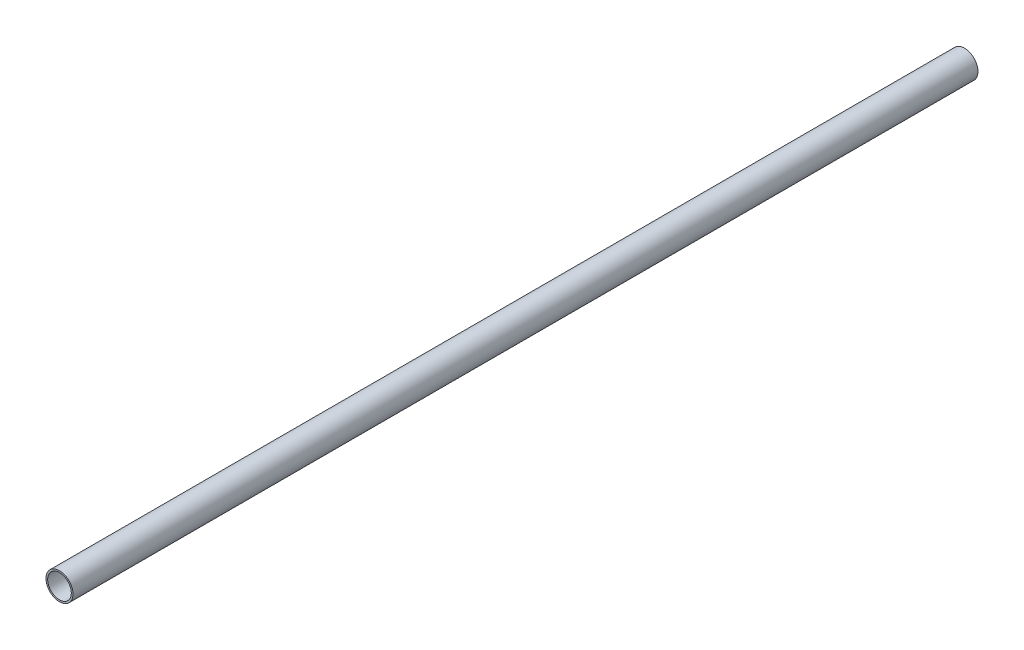
ISO-10303-21;
HEADER;
FILE_DESCRIPTION(('STEP AP214'),'2;1');
FILE_NAME('part.step','',(''),(''),'','','');
FILE_SCHEMA(('AUTOMOTIVE_DESIGN { 1 0 10303 214 1 1 1 1 }'));
ENDSEC;
DATA;
#1=APPLICATION_CONTEXT('core data for automotive mechanical design processes');
#2=APPLICATION_PROTOCOL_DEFINITION('international standard','automotive_design',2000,#1);
#3=PRODUCT_CONTEXT('',#1,'mechanical');
#4=PRODUCT('Part','Part','',(#3));
#5=PRODUCT_RELATED_PRODUCT_CATEGORY('part','',(#4));
#6=PRODUCT_DEFINITION_FORMATION('','',#4);
#7=PRODUCT_DEFINITION_CONTEXT('part definition',#1,'design');
#8=PRODUCT_DEFINITION('design','',#6,#7);
#9=PRODUCT_DEFINITION_SHAPE('','',#8);
#10=(LENGTH_UNIT() NAMED_UNIT(*) SI_UNIT(.MILLI.,.METRE.));
#11=(NAMED_UNIT(*) PLANE_ANGLE_UNIT() SI_UNIT($,.RADIAN.));
#12=(NAMED_UNIT(*) SI_UNIT($,.STERADIAN.) SOLID_ANGLE_UNIT());
#13=UNCERTAINTY_MEASURE_WITH_UNIT(LENGTH_MEASURE(1.E-05),#10,'distance_accuracy_value','');
#14=(GEOMETRIC_REPRESENTATION_CONTEXT(3) GLOBAL_UNCERTAINTY_ASSIGNED_CONTEXT((#13)) GLOBAL_UNIT_ASSIGNED_CONTEXT((#10,
#11,#12)) REPRESENTATION_CONTEXT('',''));
#15=CARTESIAN_POINT('',(0.,0.,0.));
#16=DIRECTION('',(0.,0.,1.));
#17=DIRECTION('',(1.,0.,0.));
#18=AXIS2_PLACEMENT_3D('',#15,#16,#17);
#19=CARTESIAN_POINT('',(0.,0.,914.4));
#20=DIRECTION('',(0.,0.,-1.));
#21=DIRECTION('',(-1.,0.,0.));
#22=AXIS2_PLACEMENT_3D('',#19,#20,#21);
#23=CYLINDRICAL_SURFACE('',#22,12.7);
#24=CARTESIAN_POINT('',(0.,0.,0.));
#25=DIRECTION('',(0.,0.,1.));
#26=DIRECTION('',(1.,0.,0.));
#27=AXIS2_PLACEMENT_3D('',#24,#25,#26);
#28=CIRCLE('',#27,12.7);
#29=CARTESIAN_POINT('',(12.7,0.,0.));
#30=VERTEX_POINT('',#29);
#31=EDGE_CURVE('E10',#30,#30,#28,.T.);
#32=ORIENTED_EDGE('',*,*,#31,.T.);
#33=EDGE_LOOP('',(#32));
#34=FACE_BOUND('',#33,.T.);
#35=CARTESIAN_POINT('',(0.,0.,850.9));
#36=DIRECTION('',(0.,0.,1.));
#37=DIRECTION('',(1.,0.,0.));
#38=AXIS2_PLACEMENT_3D('',#35,#36,#37);
#39=CIRCLE('',#38,12.7);
#40=CARTESIAN_POINT('',(12.7,0.,850.9));
#41=VERTEX_POINT('',#40);
#42=EDGE_CURVE('E41',#41,#41,#39,.T.);
#43=ORIENTED_EDGE('',*,*,#42,.F.);
#44=EDGE_LOOP('',(#43));
#45=FACE_BOUND('',#44,.T.);
#46=ADVANCED_FACE('F30',(#34,#45),#23,.T.);
#47=CARTESIAN_POINT('',(0.,0.,914.4));
#48=DIRECTION('',(0.,0.,-1.));
#49=DIRECTION('',(-1.,0.,0.));
#50=AXIS2_PLACEMENT_3D('',#47,#48,#49);
#51=CYLINDRICAL_SURFACE('',#50,11.1125);
#52=CARTESIAN_POINT('',(0.,0.,0.));
#53=DIRECTION('',(0.,0.,1.));
#54=DIRECTION('',(1.,0.,0.));
#55=AXIS2_PLACEMENT_3D('',#52,#53,#54);
#56=CIRCLE('',#55,11.1125);
#57=CARTESIAN_POINT('',(11.1125,0.,0.));
#58=VERTEX_POINT('',#57);
#59=EDGE_CURVE('E37',#58,#58,#56,.T.);
#60=ORIENTED_EDGE('',*,*,#59,.F.);
#61=EDGE_LOOP('',(#60));
#62=FACE_BOUND('',#61,.T.);
#63=CARTESIAN_POINT('',(0.,0.,850.9));
#64=DIRECTION('',(0.,0.,1.));
#65=DIRECTION('',(1.,0.,0.));
#66=AXIS2_PLACEMENT_3D('',#63,#64,#65);
#67=CIRCLE('',#66,11.1125);
#68=CARTESIAN_POINT('',(11.1125,0.,850.9));
#69=VERTEX_POINT('',#68);
#70=EDGE_CURVE('E33',#69,#69,#67,.T.);
#71=ORIENTED_EDGE('',*,*,#70,.T.);
#72=EDGE_LOOP('',(#71));
#73=FACE_BOUND('',#72,.T.);
#74=ADVANCED_FACE('F50',(#62,#73),#51,.F.);
#75=CARTESIAN_POINT('',(0.,0.,0.));
#76=DIRECTION('',(0.,0.,1.));
#77=DIRECTION('',(1.,0.,0.));
#78=AXIS2_PLACEMENT_3D('',#75,#76,#77);
#79=PLANE('',#78);
#80=ORIENTED_EDGE('',*,*,#31,.F.);
#81=EDGE_LOOP('',(#80));
#82=FACE_BOUND('',#81,.T.);
#83=ORIENTED_EDGE('',*,*,#59,.T.);
#84=EDGE_LOOP('',(#83));
#85=FACE_BOUND('',#84,.T.);
#86=ADVANCED_FACE('F54',(#82,#85),#79,.F.);
#87=CARTESIAN_POINT('',(-12.7,19.05,850.9));
#88=DIRECTION('',(0.,0.,1.));
#89=DIRECTION('',(1.,0.,0.));
#90=AXIS2_PLACEMENT_3D('',#87,#88,#89);
#91=PLANE('',#90);
#92=ORIENTED_EDGE('',*,*,#70,.F.);
#93=EDGE_LOOP('',(#92));
#94=FACE_BOUND('',#93,.T.);
#95=ORIENTED_EDGE('',*,*,#42,.T.);
#96=EDGE_LOOP('',(#95));
#97=FACE_BOUND('',#96,.T.);
#98=ADVANCED_FACE('F52',(#94,#97),#91,.T.);
#99=CLOSED_SHELL('',(#46,#74,#86,#98));
#100=MANIFOLD_SOLID_BREP('B2',#99);
#101=ADVANCED_BREP_SHAPE_REPRESENTATION('',(#18,#100),#14);
#102=SHAPE_DEFINITION_REPRESENTATION(#9,#101);
ENDSEC;
END-ISO-10303-21;
